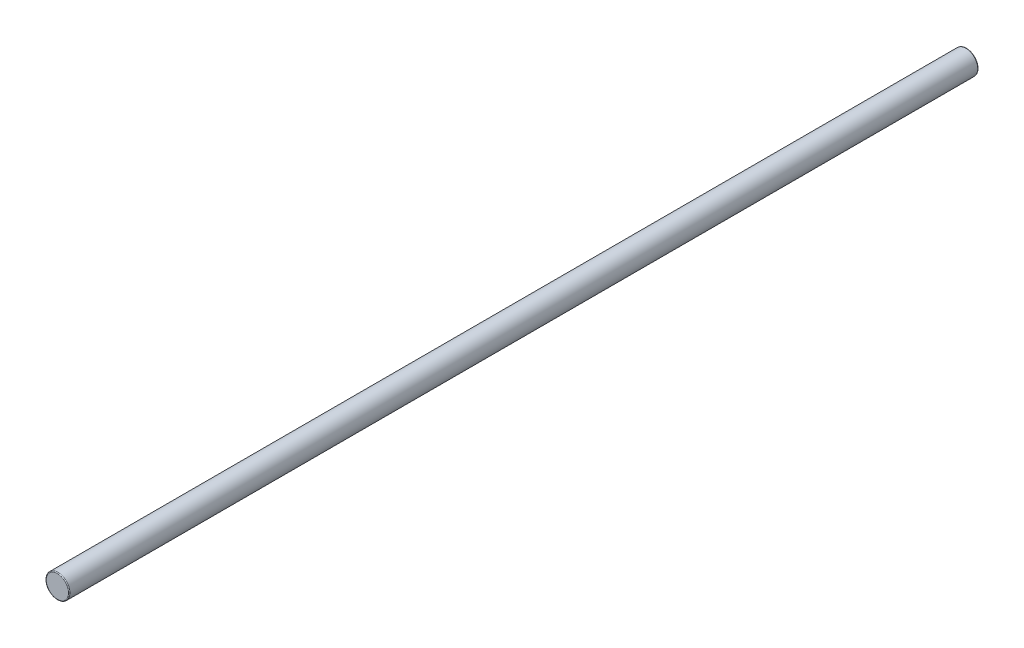
ISO-10303-21;
HEADER;
FILE_DESCRIPTION(('STEP AP214'),'2;1');
FILE_NAME('part.step','',(''),(''),'','','');
FILE_SCHEMA(('AUTOMOTIVE_DESIGN { 1 0 10303 214 1 1 1 1 }'));
ENDSEC;
DATA;
#1=APPLICATION_CONTEXT('core data for automotive mechanical design processes');
#2=APPLICATION_PROTOCOL_DEFINITION('international standard','automotive_design',2000,#1);
#3=PRODUCT_CONTEXT('',#1,'mechanical');
#4=PRODUCT('Part','Part','',(#3));
#5=PRODUCT_RELATED_PRODUCT_CATEGORY('part','',(#4));
#6=PRODUCT_DEFINITION_FORMATION('','',#4);
#7=PRODUCT_DEFINITION_CONTEXT('part definition',#1,'design');
#8=PRODUCT_DEFINITION('design','',#6,#7);
#9=PRODUCT_DEFINITION_SHAPE('','',#8);
#10=(LENGTH_UNIT() NAMED_UNIT(*) SI_UNIT(.MILLI.,.METRE.));
#11=(NAMED_UNIT(*) PLANE_ANGLE_UNIT() SI_UNIT($,.RADIAN.));
#12=(NAMED_UNIT(*) SI_UNIT($,.STERADIAN.) SOLID_ANGLE_UNIT());
#13=UNCERTAINTY_MEASURE_WITH_UNIT(LENGTH_MEASURE(1.E-05),#10,'distance_accuracy_value','');
#14=(GEOMETRIC_REPRESENTATION_CONTEXT(3) GLOBAL_UNCERTAINTY_ASSIGNED_CONTEXT((#13)) GLOBAL_UNIT_ASSIGNED_CONTEXT((#10,
#11,#12)) REPRESENTATION_CONTEXT('',''));
#15=CARTESIAN_POINT('',(0.,0.,0.));
#16=DIRECTION('',(0.,0.,1.));
#17=DIRECTION('',(1.,0.,0.));
#18=AXIS2_PLACEMENT_3D('',#15,#16,#17);
#19=CARTESIAN_POINT('',(0.,0.,-230.));
#20=DIRECTION('',(0.,0.,1.));
#21=DIRECTION('',(1.,0.,0.));
#22=AXIS2_PLACEMENT_3D('',#19,#20,#21);
#23=CYLINDRICAL_SURFACE('',#22,3.);
#24=CARTESIAN_POINT('',(0.,0.,-229.8));
#25=DIRECTION('',(0.,0.,1.));
#26=DIRECTION('',(1.,0.,0.));
#27=AXIS2_PLACEMENT_3D('',#24,#25,#26);
#28=CIRCLE('',#27,3.);
#29=CARTESIAN_POINT('',(3.,0.,-229.8));
#30=VERTEX_POINT('',#29);
#31=EDGE_CURVE('E42',#30,#30,#28,.T.);
#32=ORIENTED_EDGE('',*,*,#31,.T.);
#33=EDGE_LOOP('',(#32));
#34=FACE_BOUND('',#33,.T.);
#35=CARTESIAN_POINT('',(0.,0.,-0.200000000000006));
#36=DIRECTION('',(0.,0.,1.));
#37=DIRECTION('',(1.,0.,0.));
#38=AXIS2_PLACEMENT_3D('',#35,#36,#37);
#39=CIRCLE('',#38,3.);
#40=CARTESIAN_POINT('',(3.,0.,-0.200000000000006));
#41=VERTEX_POINT('',#40);
#42=EDGE_CURVE('E46',#41,#41,#39,.F.);
#43=ORIENTED_EDGE('',*,*,#42,.T.);
#44=EDGE_LOOP('',(#43));
#45=FACE_BOUND('',#44,.T.);
#46=ADVANCED_FACE('F31',(#34,#45),#23,.T.);
#47=CARTESIAN_POINT('',(0.,0.,-230.));
#48=DIRECTION('',(0.,0.,1.));
#49=DIRECTION('',(1.,0.,0.));
#50=AXIS2_PLACEMENT_3D('',#47,#48,#49);
#51=PLANE('',#50);
#52=CARTESIAN_POINT('',(0.,0.,-230.));
#53=DIRECTION('',(0.,0.,1.));
#54=DIRECTION('',(1.,0.,0.));
#55=AXIS2_PLACEMENT_3D('',#52,#53,#54);
#56=CIRCLE('',#55,2.8);
#57=CARTESIAN_POINT('',(2.8,0.,-230.));
#58=VERTEX_POINT('',#57);
#59=EDGE_CURVE('E38',#58,#58,#56,.F.);
#60=ORIENTED_EDGE('',*,*,#59,.T.);
#61=EDGE_LOOP('',(#60));
#62=FACE_BOUND('',#61,.T.);
#63=ADVANCED_FACE('F62',(#62),#51,.F.);
#64=CARTESIAN_POINT('',(0.,0.,0.));
#65=DIRECTION('',(0.,0.,1.));
#66=DIRECTION('',(1.,0.,0.));
#67=AXIS2_PLACEMENT_3D('',#64,#65,#66);
#68=PLANE('',#67);
#69=CARTESIAN_POINT('',(0.,0.,0.));
#70=DIRECTION('',(0.,0.,1.));
#71=DIRECTION('',(1.,0.,0.));
#72=AXIS2_PLACEMENT_3D('',#69,#70,#71);
#73=CIRCLE('',#72,2.8);
#74=CARTESIAN_POINT('',(2.8,0.,0.));
#75=VERTEX_POINT('',#74);
#76=EDGE_CURVE('E10',#75,#75,#73,.T.);
#77=ORIENTED_EDGE('',*,*,#76,.T.);
#78=EDGE_LOOP('',(#77));
#79=FACE_BOUND('',#78,.T.);
#80=ADVANCED_FACE('F59',(#79),#68,.T.);
#81=CARTESIAN_POINT('',(0.,0.,-229.8));
#82=DIRECTION('',(0.,0.,1.));
#83=DIRECTION('',(1.,0.,0.));
#84=AXIS2_PLACEMENT_3D('',#81,#82,#83);
#85=TOROIDAL_SURFACE('',#84,2.8,0.2);
#86=ORIENTED_EDGE('',*,*,#59,.F.);
#87=EDGE_LOOP('',(#86));
#88=FACE_BOUND('',#87,.T.);
#89=ORIENTED_EDGE('',*,*,#31,.F.);
#90=EDGE_LOOP('',(#89));
#91=FACE_BOUND('',#90,.T.);
#92=ADVANCED_FACE('F55',(#88,#91),#85,.T.);
#93=CARTESIAN_POINT('',(0.,0.,-0.200000000000006));
#94=DIRECTION('',(0.,0.,1.));
#95=DIRECTION('',(1.,0.,0.));
#96=AXIS2_PLACEMENT_3D('',#93,#94,#95);
#97=TOROIDAL_SURFACE('',#96,2.8,0.2);
#98=ORIENTED_EDGE('',*,*,#42,.F.);
#99=EDGE_LOOP('',(#98));
#100=FACE_BOUND('',#99,.T.);
#101=ORIENTED_EDGE('',*,*,#76,.F.);
#102=EDGE_LOOP('',(#101));
#103=FACE_BOUND('',#102,.T.);
#104=ADVANCED_FACE('F33',(#100,#103),#97,.T.);
#105=CLOSED_SHELL('',(#46,#63,#80,#92,#104));
#106=MANIFOLD_SOLID_BREP('B2',#105);
#107=ADVANCED_BREP_SHAPE_REPRESENTATION('',(#18,#106),#14);
#108=SHAPE_DEFINITION_REPRESENTATION(#9,#107);
ENDSEC;
END-ISO-10303-21;
